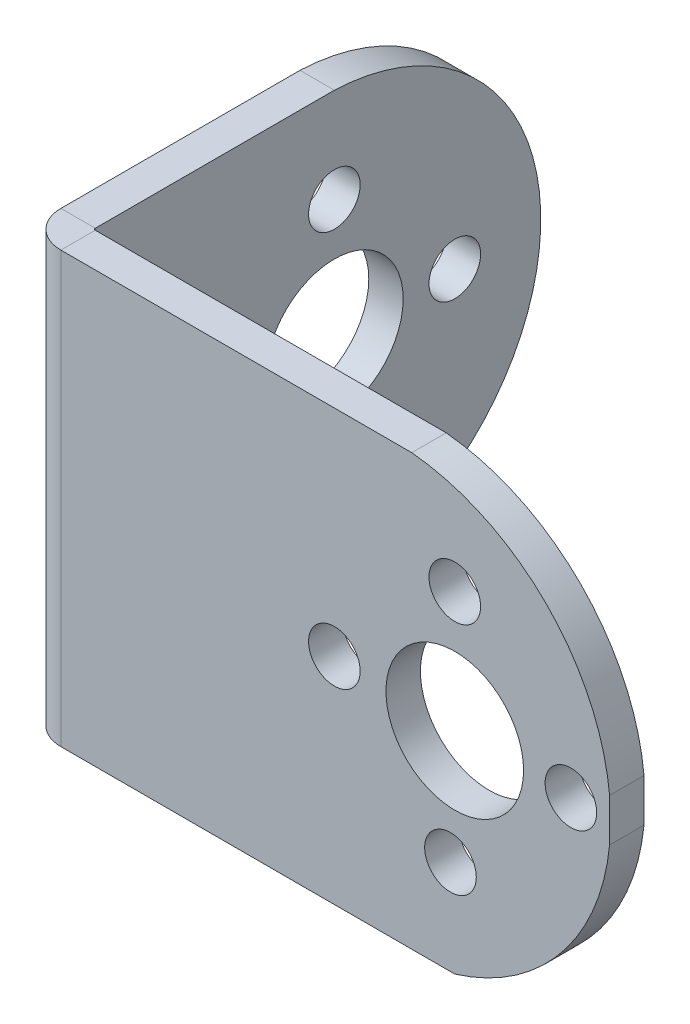
ISO-10303-21;
HEADER;
FILE_DESCRIPTION(('STEP AP214'),'2;1');
FILE_NAME('part.step','',(''),(''),'','','');
FILE_SCHEMA(('AUTOMOTIVE_DESIGN { 1 0 10303 214 1 1 1 1 }'));
ENDSEC;
DATA;
#1=APPLICATION_CONTEXT('core data for automotive mechanical design processes');
#2=APPLICATION_PROTOCOL_DEFINITION('international standard','automotive_design',2000,#1);
#3=PRODUCT_CONTEXT('',#1,'mechanical');
#4=PRODUCT('Part','Part','',(#3));
#5=PRODUCT_RELATED_PRODUCT_CATEGORY('part','',(#4));
#6=PRODUCT_DEFINITION_FORMATION('','',#4);
#7=PRODUCT_DEFINITION_CONTEXT('part definition',#1,'design');
#8=PRODUCT_DEFINITION('design','',#6,#7);
#9=PRODUCT_DEFINITION_SHAPE('','',#8);
#10=(LENGTH_UNIT() NAMED_UNIT(*) SI_UNIT(.MILLI.,.METRE.));
#11=(NAMED_UNIT(*) PLANE_ANGLE_UNIT() SI_UNIT($,.RADIAN.));
#12=(NAMED_UNIT(*) SI_UNIT($,.STERADIAN.) SOLID_ANGLE_UNIT());
#13=UNCERTAINTY_MEASURE_WITH_UNIT(LENGTH_MEASURE(1.E-05),#10,'distance_accuracy_value','');
#14=(GEOMETRIC_REPRESENTATION_CONTEXT(3) GLOBAL_UNCERTAINTY_ASSIGNED_CONTEXT((#13)) GLOBAL_UNIT_ASSIGNED_CONTEXT((#10,
#11,#12)) REPRESENTATION_CONTEXT('',''));
#15=CARTESIAN_POINT('',(0.,0.,0.));
#16=DIRECTION('',(0.,0.,1.));
#17=DIRECTION('',(1.,0.,0.));
#18=AXIS2_PLACEMENT_3D('',#15,#16,#17);
#19=CARTESIAN_POINT('',(2.00000000000001,0.,0.));
#20=DIRECTION('',(0.,1.,0.));
#21=DIRECTION('',(0.,0.,1.));
#22=AXIS2_PLACEMENT_3D('',#19,#20,#21);
#23=PLANE('',#22);
#24=DIRECTION('',(1.,0.,0.));
#25=VECTOR('',#24,1.);
#26=CARTESIAN_POINT('',(2.,0.,-2.1));
#27=LINE('',#26,#25);
#28=CARTESIAN_POINT('',(0.,0.,-2.10000000000001));
#29=VERTEX_POINT('',#28);
#30=CARTESIAN_POINT('',(2.,0.,-2.10000000000001));
#31=VERTEX_POINT('',#30);
#32=EDGE_CURVE('E12',#29,#31,#27,.T.);
#33=ORIENTED_EDGE('',*,*,#32,.F.);
#34=DIRECTION('',(0.,0.,-1.));
#35=VECTOR('',#34,1.);
#36=CARTESIAN_POINT('',(0.,0.,0.));
#37=LINE('',#36,#35);
#38=CARTESIAN_POINT('',(0.,0.,-16.));
#39=VERTEX_POINT('',#38);
#40=EDGE_CURVE('E187',#39,#29,#37,.F.);
#41=ORIENTED_EDGE('',*,*,#40,.F.);
#42=DIRECTION('',(1.,0.,0.));
#43=VECTOR('',#42,1.);
#44=CARTESIAN_POINT('',(2.,0.,-16.));
#45=LINE('',#44,#43);
#46=CARTESIAN_POINT('',(2.,0.,-16.));
#47=VERTEX_POINT('',#46);
#48=EDGE_CURVE('E100',#39,#47,#45,.T.);
#49=ORIENTED_EDGE('',*,*,#48,.T.);
#50=DIRECTION('',(0.,0.,1.));
#51=VECTOR('',#50,1.);
#52=CARTESIAN_POINT('',(2.00000000000001,0.,0.));
#53=LINE('',#52,#51);
#54=EDGE_CURVE('E208',#47,#31,#53,.T.);
#55=ORIENTED_EDGE('',*,*,#54,.T.);
#56=EDGE_LOOP('',(#33,#41,#49,#55));
#57=FACE_BOUND('',#56,.T.);
#58=ADVANCED_FACE('F71',(#57),#23,.F.);
#59=CARTESIAN_POINT('',(2.,12.5,-15.4895833333333));
#60=DIRECTION('',(1.,0.,0.));
#61=DIRECTION('',(0.,0.,-1.));
#62=AXIS2_PLACEMENT_3D('',#59,#60,#61);
#63=CYLINDRICAL_SURFACE('',#62,12.5104166666667);
#64=ORIENTED_EDGE('',*,*,#48,.F.);
#65=CARTESIAN_POINT('',(0.,12.5,-15.4895833333333));
#66=DIRECTION('',(1.,0.,0.));
#67=DIRECTION('',(0.,0.,-1.));
#68=AXIS2_PLACEMENT_3D('',#65,#66,#67);
#69=CIRCLE('',#68,12.5104166666667);
#70=CARTESIAN_POINT('',(0.,25.,-16.));
#71=VERTEX_POINT('',#70);
#72=EDGE_CURVE('E203',#71,#39,#69,.F.);
#73=ORIENTED_EDGE('',*,*,#72,.F.);
#74=DIRECTION('',(1.,0.,0.));
#75=VECTOR('',#74,1.);
#76=CARTESIAN_POINT('',(2.,25.,-16.));
#77=LINE('',#76,#75);
#78=CARTESIAN_POINT('',(2.,25.,-16.));
#79=VERTEX_POINT('',#78);
#80=EDGE_CURVE('E88',#71,#79,#77,.T.);
#81=ORIENTED_EDGE('',*,*,#80,.T.);
#82=CARTESIAN_POINT('',(2.,12.5,-15.4895833333333));
#83=DIRECTION('',(1.,0.,0.));
#84=DIRECTION('',(0.,0.,-1.));
#85=AXIS2_PLACEMENT_3D('',#82,#83,#84);
#86=CIRCLE('',#85,12.5104166666667);
#87=EDGE_CURVE('E175',#79,#47,#86,.F.);
#88=ORIENTED_EDGE('',*,*,#87,.T.);
#89=EDGE_LOOP('',(#64,#73,#81,#88));
#90=FACE_BOUND('',#89,.T.);
#91=ADVANCED_FACE('F345',(#90),#63,.T.);
#92=CARTESIAN_POINT('',(2.00000000000001,25.,0.));
#93=DIRECTION('',(0.,1.,0.));
#94=DIRECTION('',(0.,0.,1.));
#95=AXIS2_PLACEMENT_3D('',#92,#93,#94);
#96=PLANE('',#95);
#97=ORIENTED_EDGE('',*,*,#80,.F.);
#98=DIRECTION('',(0.,0.,-1.));
#99=VECTOR('',#98,1.);
#100=CARTESIAN_POINT('',(0.,25.,0.));
#101=LINE('',#100,#99);
#102=CARTESIAN_POINT('',(0.,25.,-2.10000000000001));
#103=VERTEX_POINT('',#102);
#104=EDGE_CURVE('E178',#71,#103,#101,.F.);
#105=ORIENTED_EDGE('',*,*,#104,.T.);
#106=DIRECTION('',(1.,0.,0.));
#107=VECTOR('',#106,1.);
#108=CARTESIAN_POINT('',(2.,25.,-2.1));
#109=LINE('',#108,#107);
#110=CARTESIAN_POINT('',(2.,25.,-2.1));
#111=VERTEX_POINT('',#110);
#112=EDGE_CURVE('E161',#103,#111,#109,.T.);
#113=ORIENTED_EDGE('',*,*,#112,.T.);
#114=DIRECTION('',(0.,0.,1.));
#115=VECTOR('',#114,1.);
#116=CARTESIAN_POINT('',(2.00000000000001,25.,0.));
#117=LINE('',#116,#115);
#118=EDGE_CURVE('E173',#79,#111,#117,.T.);
#119=ORIENTED_EDGE('',*,*,#118,.F.);
#120=EDGE_LOOP('',(#97,#105,#113,#119));
#121=FACE_BOUND('',#120,.T.);
#122=ADVANCED_FACE('F177',(#121),#96,.T.);
#123=CARTESIAN_POINT('',(2.,5.5,-16.));
#124=DIRECTION('',(1.,0.,0.));
#125=DIRECTION('',(0.,0.,-1.));
#126=AXIS2_PLACEMENT_3D('',#123,#124,#125);
#127=CYLINDRICAL_SURFACE('',#126,1.5);
#128=CARTESIAN_POINT('',(2.,5.5,-16.));
#129=DIRECTION('',(1.,0.,0.));
#130=DIRECTION('',(0.,0.,-1.));
#131=AXIS2_PLACEMENT_3D('',#128,#129,#130);
#132=CIRCLE('',#131,1.5);
#133=CARTESIAN_POINT('',(2.,5.5,-17.5));
#134=VERTEX_POINT('',#133);
#135=EDGE_CURVE('E205',#134,#134,#132,.T.);
#136=ORIENTED_EDGE('',*,*,#135,.T.);
#137=EDGE_LOOP('',(#136));
#138=FACE_BOUND('',#137,.T.);
#139=CARTESIAN_POINT('',(0.,5.5,-16.));
#140=DIRECTION('',(1.,0.,0.));
#141=DIRECTION('',(0.,0.,-1.));
#142=AXIS2_PLACEMENT_3D('',#139,#140,#141);
#143=CIRCLE('',#142,1.5);
#144=CARTESIAN_POINT('',(0.,5.5,-17.5));
#145=VERTEX_POINT('',#144);
#146=EDGE_CURVE('E197',#145,#145,#143,.T.);
#147=ORIENTED_EDGE('',*,*,#146,.F.);
#148=EDGE_LOOP('',(#147));
#149=FACE_BOUND('',#148,.T.);
#150=ADVANCED_FACE('F355',(#138,#149),#127,.F.);
#151=CARTESIAN_POINT('',(2.,12.5,-23.));
#152=DIRECTION('',(1.,0.,0.));
#153=DIRECTION('',(0.,0.,-1.));
#154=AXIS2_PLACEMENT_3D('',#151,#152,#153);
#155=CYLINDRICAL_SURFACE('',#154,1.5);
#156=CARTESIAN_POINT('',(2.,12.5,-23.));
#157=DIRECTION('',(1.,0.,0.));
#158=DIRECTION('',(0.,0.,-1.));
#159=AXIS2_PLACEMENT_3D('',#156,#157,#158);
#160=CIRCLE('',#159,1.5);
#161=CARTESIAN_POINT('',(2.,12.5,-24.5));
#162=VERTEX_POINT('',#161);
#163=EDGE_CURVE('E220',#162,#162,#160,.T.);
#164=ORIENTED_EDGE('',*,*,#163,.T.);
#165=EDGE_LOOP('',(#164));
#166=FACE_BOUND('',#165,.T.);
#167=CARTESIAN_POINT('',(0.,12.5,-23.));
#168=DIRECTION('',(1.,0.,0.));
#169=DIRECTION('',(0.,0.,-1.));
#170=AXIS2_PLACEMENT_3D('',#167,#168,#169);
#171=CIRCLE('',#170,1.5);
#172=CARTESIAN_POINT('',(0.,12.5,-24.5));
#173=VERTEX_POINT('',#172);
#174=EDGE_CURVE('E194',#173,#173,#171,.T.);
#175=ORIENTED_EDGE('',*,*,#174,.F.);
#176=EDGE_LOOP('',(#175));
#177=FACE_BOUND('',#176,.T.);
#178=ADVANCED_FACE('F358',(#166,#177),#155,.F.);
#179=CARTESIAN_POINT('',(2.,19.5,-16.));
#180=DIRECTION('',(1.,0.,0.));
#181=DIRECTION('',(0.,0.,-1.));
#182=AXIS2_PLACEMENT_3D('',#179,#180,#181);
#183=CYLINDRICAL_SURFACE('',#182,1.5);
#184=CARTESIAN_POINT('',(2.,19.5,-16.));
#185=DIRECTION('',(1.,0.,0.));
#186=DIRECTION('',(0.,0.,-1.));
#187=AXIS2_PLACEMENT_3D('',#184,#185,#186);
#188=CIRCLE('',#187,1.5);
#189=CARTESIAN_POINT('',(2.,19.5,-17.5));
#190=VERTEX_POINT('',#189);
#191=EDGE_CURVE('E217',#190,#190,#188,.T.);
#192=ORIENTED_EDGE('',*,*,#191,.T.);
#193=EDGE_LOOP('',(#192));
#194=FACE_BOUND('',#193,.T.);
#195=CARTESIAN_POINT('',(0.,19.5,-16.));
#196=DIRECTION('',(1.,0.,0.));
#197=DIRECTION('',(0.,0.,-1.));
#198=AXIS2_PLACEMENT_3D('',#195,#196,#197);
#199=CIRCLE('',#198,1.5);
#200=CARTESIAN_POINT('',(0.,19.5,-17.5));
#201=VERTEX_POINT('',#200);
#202=EDGE_CURVE('E191',#201,#201,#199,.T.);
#203=ORIENTED_EDGE('',*,*,#202,.F.);
#204=EDGE_LOOP('',(#203));
#205=FACE_BOUND('',#204,.T.);
#206=ADVANCED_FACE('F362',(#194,#205),#183,.F.);
#207=CARTESIAN_POINT('',(2.,12.5,-9.));
#208=DIRECTION('',(1.,0.,0.));
#209=DIRECTION('',(0.,0.,-1.));
#210=AXIS2_PLACEMENT_3D('',#207,#208,#209);
#211=CYLINDRICAL_SURFACE('',#210,1.5);
#212=CARTESIAN_POINT('',(2.,12.5,-9.));
#213=DIRECTION('',(1.,0.,0.));
#214=DIRECTION('',(0.,0.,-1.));
#215=AXIS2_PLACEMENT_3D('',#212,#213,#214);
#216=CIRCLE('',#215,1.5);
#217=CARTESIAN_POINT('',(2.,12.5,-10.5));
#218=VERTEX_POINT('',#217);
#219=EDGE_CURVE('E214',#218,#218,#216,.T.);
#220=ORIENTED_EDGE('',*,*,#219,.T.);
#221=EDGE_LOOP('',(#220));
#222=FACE_BOUND('',#221,.T.);
#223=CARTESIAN_POINT('',(0.,12.5,-9.));
#224=DIRECTION('',(1.,0.,0.));
#225=DIRECTION('',(0.,0.,-1.));
#226=AXIS2_PLACEMENT_3D('',#223,#224,#225);
#227=CIRCLE('',#226,1.5);
#228=CARTESIAN_POINT('',(0.,12.5,-10.5));
#229=VERTEX_POINT('',#228);
#230=EDGE_CURVE('E188',#229,#229,#227,.T.);
#231=ORIENTED_EDGE('',*,*,#230,.F.);
#232=EDGE_LOOP('',(#231));
#233=FACE_BOUND('',#232,.T.);
#234=ADVANCED_FACE('F365',(#222,#233),#211,.F.);
#235=CARTESIAN_POINT('',(2.,12.5,-16.));
#236=DIRECTION('',(1.,0.,0.));
#237=DIRECTION('',(0.,0.,-1.));
#238=AXIS2_PLACEMENT_3D('',#235,#236,#237);
#239=CYLINDRICAL_SURFACE('',#238,4.);
#240=CARTESIAN_POINT('',(2.,12.5,-16.));
#241=DIRECTION('',(1.,0.,0.));
#242=DIRECTION('',(0.,0.,-1.));
#243=AXIS2_PLACEMENT_3D('',#240,#241,#242);
#244=CIRCLE('',#243,4.);
#245=CARTESIAN_POINT('',(2.,12.5,-20.));
#246=VERTEX_POINT('',#245);
#247=EDGE_CURVE('E211',#246,#246,#244,.T.);
#248=ORIENTED_EDGE('',*,*,#247,.T.);
#249=EDGE_LOOP('',(#248));
#250=FACE_BOUND('',#249,.T.);
#251=CARTESIAN_POINT('',(0.,12.5,-16.));
#252=DIRECTION('',(1.,0.,0.));
#253=DIRECTION('',(0.,0.,-1.));
#254=AXIS2_PLACEMENT_3D('',#251,#252,#253);
#255=CIRCLE('',#254,4.);
#256=CARTESIAN_POINT('',(0.,12.5,-20.));
#257=VERTEX_POINT('',#256);
#258=EDGE_CURVE('E184',#257,#257,#255,.T.);
#259=ORIENTED_EDGE('',*,*,#258,.F.);
#260=EDGE_LOOP('',(#259));
#261=FACE_BOUND('',#260,.T.);
#262=ADVANCED_FACE('F73',(#250,#261),#239,.F.);
#263=CARTESIAN_POINT('',(2.00000000000001,25.,0.));
#264=DIRECTION('',(1.,0.,0.));
#265=DIRECTION('',(0.,0.,-1.));
#266=AXIS2_PLACEMENT_3D('',#263,#264,#265);
#267=PLANE('',#266);
#268=ORIENTED_EDGE('',*,*,#135,.F.);
#269=EDGE_LOOP('',(#268));
#270=FACE_BOUND('',#269,.T.);
#271=ORIENTED_EDGE('',*,*,#163,.F.);
#272=EDGE_LOOP('',(#271));
#273=FACE_BOUND('',#272,.T.);
#274=ORIENTED_EDGE('',*,*,#191,.F.);
#275=EDGE_LOOP('',(#274));
#276=FACE_BOUND('',#275,.T.);
#277=ORIENTED_EDGE('',*,*,#219,.F.);
#278=EDGE_LOOP('',(#277));
#279=FACE_BOUND('',#278,.T.);
#280=ORIENTED_EDGE('',*,*,#247,.F.);
#281=EDGE_LOOP('',(#280));
#282=FACE_BOUND('',#281,.T.);
#283=ORIENTED_EDGE('',*,*,#118,.T.);
#284=DIRECTION('',(0.,-1.,0.));
#285=VECTOR('',#284,1.);
#286=CARTESIAN_POINT('',(2.,25.,-2.1));
#287=LINE('',#286,#285);
#288=EDGE_CURVE('E154',#111,#31,#287,.T.);
#289=ORIENTED_EDGE('',*,*,#288,.T.);
#290=ORIENTED_EDGE('',*,*,#54,.F.);
#291=ORIENTED_EDGE('',*,*,#87,.F.);
#292=EDGE_LOOP('',(#283,#289,#290,#291));
#293=FACE_BOUND('',#292,.T.);
#294=ADVANCED_FACE('F174',(#270,#273,#276,#279,#282,#293),#267,.T.);
#295=CARTESIAN_POINT('',(0.,25.,0.));
#296=DIRECTION('',(1.,0.,0.));
#297=DIRECTION('',(0.,0.,-1.));
#298=AXIS2_PLACEMENT_3D('',#295,#296,#297);
#299=PLANE('',#298);
#300=ORIENTED_EDGE('',*,*,#146,.T.);
#301=EDGE_LOOP('',(#300));
#302=FACE_BOUND('',#301,.T.);
#303=ORIENTED_EDGE('',*,*,#174,.T.);
#304=EDGE_LOOP('',(#303));
#305=FACE_BOUND('',#304,.T.);
#306=ORIENTED_EDGE('',*,*,#202,.T.);
#307=EDGE_LOOP('',(#306));
#308=FACE_BOUND('',#307,.T.);
#309=ORIENTED_EDGE('',*,*,#230,.T.);
#310=EDGE_LOOP('',(#309));
#311=FACE_BOUND('',#310,.T.);
#312=ORIENTED_EDGE('',*,*,#258,.T.);
#313=EDGE_LOOP('',(#312));
#314=FACE_BOUND('',#313,.T.);
#315=ORIENTED_EDGE('',*,*,#104,.F.);
#316=ORIENTED_EDGE('',*,*,#72,.T.);
#317=ORIENTED_EDGE('',*,*,#40,.T.);
#318=DIRECTION('',(0.,-1.,0.));
#319=VECTOR('',#318,1.);
#320=CARTESIAN_POINT('',(0.,25.,-2.1));
#321=LINE('',#320,#319);
#322=EDGE_CURVE('E80',#103,#29,#321,.T.);
#323=ORIENTED_EDGE('',*,*,#322,.F.);
#324=EDGE_LOOP('',(#315,#316,#317,#323));
#325=FACE_BOUND('',#324,.T.);
#326=ADVANCED_FACE('F377',(#302,#305,#308,#311,#314,#325),#299,.F.);
#327=CARTESIAN_POINT('',(21.25,12.25,-2.00000000000001));
#328=DIRECTION('',(0.,0.,1.));
#329=DIRECTION('',(1.,0.,0.));
#330=AXIS2_PLACEMENT_3D('',#327,#328,#329);
#331=CYLINDRICAL_SURFACE('',#330,12.811127975319);
#332=DIRECTION('',(0.,0.,-1.));
#333=VECTOR('',#332,1.);
#334=CARTESIAN_POINT('',(34.,11.,-2.00000000000001));
#335=LINE('',#334,#333);
#336=CARTESIAN_POINT('',(34.,11.,0.));
#337=VERTEX_POINT('',#336);
#338=CARTESIAN_POINT('',(34.,11.,-2.00000000000001));
#339=VERTEX_POINT('',#338);
#340=EDGE_CURVE('E236',#337,#339,#335,.T.);
#341=ORIENTED_EDGE('',*,*,#340,.F.);
#342=CARTESIAN_POINT('',(21.25,12.25,0.));
#343=DIRECTION('',(0.,0.,1.));
#344=DIRECTION('',(1.,0.,0.));
#345=AXIS2_PLACEMENT_3D('',#342,#343,#344);
#346=CIRCLE('',#345,12.811127975319);
#347=CARTESIAN_POINT('',(25.,0.,0.));
#348=VERTEX_POINT('',#347);
#349=EDGE_CURVE('E285',#348,#337,#346,.T.);
#350=ORIENTED_EDGE('',*,*,#349,.F.);
#351=DIRECTION('',(0.,0.,-1.));
#352=VECTOR('',#351,1.);
#353=CARTESIAN_POINT('',(25.,0.,-2.));
#354=LINE('',#353,#352);
#355=CARTESIAN_POINT('',(25.,0.,-2.));
#356=VERTEX_POINT('',#355);
#357=EDGE_CURVE('E228',#348,#356,#354,.T.);
#358=ORIENTED_EDGE('',*,*,#357,.T.);
#359=CARTESIAN_POINT('',(21.25,12.25,-2.00000000000001));
#360=DIRECTION('',(0.,0.,1.));
#361=DIRECTION('',(1.,0.,0.));
#362=AXIS2_PLACEMENT_3D('',#359,#360,#361);
#363=CIRCLE('',#362,12.811127975319);
#364=EDGE_CURVE('E230',#356,#339,#363,.T.);
#365=ORIENTED_EDGE('',*,*,#364,.T.);
#366=EDGE_LOOP('',(#341,#350,#358,#365));
#367=FACE_BOUND('',#366,.T.);
#368=ADVANCED_FACE('F319',(#367),#331,.T.);
#369=CARTESIAN_POINT('',(34.,25.,-2.));
#370=DIRECTION('',(-1.,0.,0.));
#371=DIRECTION('',(0.,-1.,0.));
#372=AXIS2_PLACEMENT_3D('',#369,#370,#371);
#373=PLANE('',#372);
#374=DIRECTION('',(0.,0.,-1.));
#375=VECTOR('',#374,1.);
#376=CARTESIAN_POINT('',(34.,13.5,-2.));
#377=LINE('',#376,#375);
#378=CARTESIAN_POINT('',(34.,13.5,0.));
#379=VERTEX_POINT('',#378);
#380=CARTESIAN_POINT('',(34.,13.5,-2.));
#381=VERTEX_POINT('',#380);
#382=EDGE_CURVE('E238',#379,#381,#377,.T.);
#383=ORIENTED_EDGE('',*,*,#382,.F.);
#384=DIRECTION('',(0.,1.,0.));
#385=VECTOR('',#384,1.);
#386=CARTESIAN_POINT('',(34.,25.,0.));
#387=LINE('',#386,#385);
#388=EDGE_CURVE('E233',#379,#337,#387,.F.);
#389=ORIENTED_EDGE('',*,*,#388,.T.);
#390=ORIENTED_EDGE('',*,*,#340,.T.);
#391=DIRECTION('',(0.,-1.,0.));
#392=VECTOR('',#391,1.);
#393=CARTESIAN_POINT('',(34.,25.,-2.));
#394=LINE('',#393,#392);
#395=EDGE_CURVE('E278',#381,#339,#394,.T.);
#396=ORIENTED_EDGE('',*,*,#395,.F.);
#397=EDGE_LOOP('',(#383,#389,#390,#396));
#398=FACE_BOUND('',#397,.T.);
#399=ADVANCED_FACE('F326',(#398),#373,.F.);
#400=CARTESIAN_POINT('',(21.25,12.25,-2.00000000000001));
#401=DIRECTION('',(0.,0.,1.));
#402=DIRECTION('',(1.,0.,0.));
#403=AXIS2_PLACEMENT_3D('',#400,#401,#402);
#404=CYLINDRICAL_SURFACE('',#403,12.811127975319);
#405=DIRECTION('',(0.,0.,-1.));
#406=VECTOR('',#405,1.);
#407=CARTESIAN_POINT('',(22.5,25.,-2.00000000000001));
#408=LINE('',#407,#406);
#409=CARTESIAN_POINT('',(22.5,25.,0.));
#410=VERTEX_POINT('',#409);
#411=CARTESIAN_POINT('',(22.5,25.,-2.00000000000001));
#412=VERTEX_POINT('',#411);
#413=EDGE_CURVE('E281',#410,#412,#408,.T.);
#414=ORIENTED_EDGE('',*,*,#413,.F.);
#415=CARTESIAN_POINT('',(21.25,12.25,0.));
#416=DIRECTION('',(0.,0.,1.));
#417=DIRECTION('',(1.,0.,0.));
#418=AXIS2_PLACEMENT_3D('',#415,#416,#417);
#419=CIRCLE('',#418,12.811127975319);
#420=EDGE_CURVE('E288',#379,#410,#419,.T.);
#421=ORIENTED_EDGE('',*,*,#420,.F.);
#422=ORIENTED_EDGE('',*,*,#382,.T.);
#423=CARTESIAN_POINT('',(21.25,12.25,-2.00000000000001));
#424=DIRECTION('',(0.,0.,1.));
#425=DIRECTION('',(1.,0.,0.));
#426=AXIS2_PLACEMENT_3D('',#423,#424,#425);
#427=CIRCLE('',#426,12.811127975319);
#428=EDGE_CURVE('E240',#381,#412,#427,.T.);
#429=ORIENTED_EDGE('',*,*,#428,.T.);
#430=EDGE_LOOP('',(#414,#421,#422,#429));
#431=FACE_BOUND('',#430,.T.);
#432=ADVANCED_FACE('F330',(#431),#404,.T.);
#433=CARTESIAN_POINT('',(25.,12.25,-2.00000000000001));
#434=DIRECTION('',(0.,0.,1.));
#435=DIRECTION('',(1.,0.,0.));
#436=AXIS2_PLACEMENT_3D('',#433,#434,#435);
#437=CYLINDRICAL_SURFACE('',#436,4.);
#438=CARTESIAN_POINT('',(25.,12.25,-2.00000000000001));
#439=DIRECTION('',(0.,0.,1.));
#440=DIRECTION('',(1.,0.,0.));
#441=AXIS2_PLACEMENT_3D('',#438,#439,#440);
#442=CIRCLE('',#441,4.);
#443=CARTESIAN_POINT('',(29.,12.25,-2.00000000000001));
#444=VERTEX_POINT('',#443);
#445=EDGE_CURVE('E270',#444,#444,#442,.T.);
#446=ORIENTED_EDGE('',*,*,#445,.F.);
#447=EDGE_LOOP('',(#446));
#448=FACE_BOUND('',#447,.T.);
#449=CARTESIAN_POINT('',(25.,12.25,0.));
#450=DIRECTION('',(0.,0.,1.));
#451=DIRECTION('',(1.,0.,0.));
#452=AXIS2_PLACEMENT_3D('',#449,#450,#451);
#453=CIRCLE('',#452,4.);
#454=CARTESIAN_POINT('',(29.,12.25,0.));
#455=VERTEX_POINT('',#454);
#456=EDGE_CURVE('E243',#455,#455,#453,.T.);
#457=ORIENTED_EDGE('',*,*,#456,.T.);
#458=EDGE_LOOP('',(#457));
#459=FACE_BOUND('',#458,.T.);
#460=ADVANCED_FACE('F462',(#448,#459),#437,.F.);
#461=CARTESIAN_POINT('',(18.0000000000001,12.5,-2.00000000000001));
#462=DIRECTION('',(0.,0.,1.));
#463=DIRECTION('',(1.,0.,0.));
#464=AXIS2_PLACEMENT_3D('',#461,#462,#463);
#465=CYLINDRICAL_SURFACE('',#464,1.5);
#466=CARTESIAN_POINT('',(18.0000000000001,12.5,-2.00000000000001));
#467=DIRECTION('',(0.,0.,1.));
#468=DIRECTION('',(1.,0.,0.));
#469=AXIS2_PLACEMENT_3D('',#466,#467,#468);
#470=CIRCLE('',#469,1.5);
#471=CARTESIAN_POINT('',(19.5000000000001,12.5,-2.00000000000001));
#472=VERTEX_POINT('',#471);
#473=EDGE_CURVE('E267',#472,#472,#470,.T.);
#474=ORIENTED_EDGE('',*,*,#473,.F.);
#475=EDGE_LOOP('',(#474));
#476=FACE_BOUND('',#475,.T.);
#477=CARTESIAN_POINT('',(18.0000000000001,12.5,0.));
#478=DIRECTION('',(0.,0.,1.));
#479=DIRECTION('',(1.,0.,0.));
#480=AXIS2_PLACEMENT_3D('',#477,#478,#479);
#481=CIRCLE('',#480,1.5);
#482=CARTESIAN_POINT('',(19.5000000000001,12.5,0.));
#483=VERTEX_POINT('',#482);
#484=EDGE_CURVE('E246',#483,#483,#481,.T.);
#485=ORIENTED_EDGE('',*,*,#484,.T.);
#486=EDGE_LOOP('',(#485));
#487=FACE_BOUND('',#486,.T.);
#488=ADVANCED_FACE('F472',(#476,#487),#465,.F.);
#489=CARTESIAN_POINT('',(24.7500000000001,5.50000000000007,-2.00000000000001));
#490=DIRECTION('',(0.,0.,1.));
#491=DIRECTION('',(1.,0.,0.));
#492=AXIS2_PLACEMENT_3D('',#489,#490,#491);
#493=CYLINDRICAL_SURFACE('',#492,1.5);
#494=CARTESIAN_POINT('',(24.7500000000001,5.50000000000007,-2.00000000000001));
#495=DIRECTION('',(0.,0.,1.));
#496=DIRECTION('',(1.,0.,0.));
#497=AXIS2_PLACEMENT_3D('',#494,#495,#496);
#498=CIRCLE('',#497,1.5);
#499=CARTESIAN_POINT('',(26.2500000000001,5.50000000000007,-2.00000000000001));
#500=VERTEX_POINT('',#499);
#501=EDGE_CURVE('E264',#500,#500,#498,.T.);
#502=ORIENTED_EDGE('',*,*,#501,.F.);
#503=EDGE_LOOP('',(#502));
#504=FACE_BOUND('',#503,.T.);
#505=CARTESIAN_POINT('',(24.7500000000001,5.50000000000007,0.));
#506=DIRECTION('',(0.,0.,1.));
#507=DIRECTION('',(1.,0.,0.));
#508=AXIS2_PLACEMENT_3D('',#505,#506,#507);
#509=CIRCLE('',#508,1.5);
#510=CARTESIAN_POINT('',(26.2500000000001,5.50000000000007,0.));
#511=VERTEX_POINT('',#510);
#512=EDGE_CURVE('E249',#511,#511,#509,.T.);
#513=ORIENTED_EDGE('',*,*,#512,.T.);
#514=EDGE_LOOP('',(#513));
#515=FACE_BOUND('',#514,.T.);
#516=ADVANCED_FACE('F483',(#504,#515),#493,.F.);
#517=CARTESIAN_POINT('',(31.75,12.2500000000001,-2.00000000000001));
#518=DIRECTION('',(0.,0.,1.));
#519=DIRECTION('',(1.,0.,0.));
#520=AXIS2_PLACEMENT_3D('',#517,#518,#519);
#521=CYLINDRICAL_SURFACE('',#520,1.5);
#522=CARTESIAN_POINT('',(31.75,12.2500000000001,-2.00000000000001));
#523=DIRECTION('',(0.,0.,1.));
#524=DIRECTION('',(1.,0.,0.));
#525=AXIS2_PLACEMENT_3D('',#522,#523,#524);
#526=CIRCLE('',#525,1.5);
#527=CARTESIAN_POINT('',(33.25,12.2500000000001,-2.00000000000001));
#528=VERTEX_POINT('',#527);
#529=EDGE_CURVE('E261',#528,#528,#526,.T.);
#530=ORIENTED_EDGE('',*,*,#529,.F.);
#531=EDGE_LOOP('',(#530));
#532=FACE_BOUND('',#531,.T.);
#533=CARTESIAN_POINT('',(31.75,12.2500000000001,0.));
#534=DIRECTION('',(0.,0.,1.));
#535=DIRECTION('',(1.,0.,0.));
#536=AXIS2_PLACEMENT_3D('',#533,#534,#535);
#537=CIRCLE('',#536,1.5);
#538=CARTESIAN_POINT('',(33.25,12.2500000000001,0.));
#539=VERTEX_POINT('',#538);
#540=EDGE_CURVE('E252',#539,#539,#537,.T.);
#541=ORIENTED_EDGE('',*,*,#540,.T.);
#542=EDGE_LOOP('',(#541));
#543=FACE_BOUND('',#542,.T.);
#544=ADVANCED_FACE('F494',(#532,#543),#521,.F.);
#545=CARTESIAN_POINT('',(25.,19.25,-2.00000000000001));
#546=DIRECTION('',(0.,0.,1.));
#547=DIRECTION('',(1.,0.,0.));
#548=AXIS2_PLACEMENT_3D('',#545,#546,#547);
#549=CYLINDRICAL_SURFACE('',#548,1.5);
#550=CARTESIAN_POINT('',(25.,19.25,-2.00000000000001));
#551=DIRECTION('',(0.,0.,1.));
#552=DIRECTION('',(1.,0.,0.));
#553=AXIS2_PLACEMENT_3D('',#550,#551,#552);
#554=CIRCLE('',#553,1.5);
#555=CARTESIAN_POINT('',(26.5,19.25,-2.00000000000001));
#556=VERTEX_POINT('',#555);
#557=EDGE_CURVE('E258',#556,#556,#554,.T.);
#558=ORIENTED_EDGE('',*,*,#557,.F.);
#559=EDGE_LOOP('',(#558));
#560=FACE_BOUND('',#559,.T.);
#561=CARTESIAN_POINT('',(25.,19.25,0.));
#562=DIRECTION('',(0.,0.,1.));
#563=DIRECTION('',(1.,0.,0.));
#564=AXIS2_PLACEMENT_3D('',#561,#562,#563);
#565=CIRCLE('',#564,1.5);
#566=CARTESIAN_POINT('',(26.5,19.25,0.));
#567=VERTEX_POINT('',#566);
#568=EDGE_CURVE('E255',#567,#567,#565,.T.);
#569=ORIENTED_EDGE('',*,*,#568,.T.);
#570=EDGE_LOOP('',(#569));
#571=FACE_BOUND('',#570,.T.);
#572=ADVANCED_FACE('F341',(#560,#571),#549,.F.);
#573=CARTESIAN_POINT('',(34.,25.,-2.));
#574=DIRECTION('',(0.,0.,1.));
#575=DIRECTION('',(1.,0.,0.));
#576=AXIS2_PLACEMENT_3D('',#573,#574,#575);
#577=PLANE('',#576);
#578=ORIENTED_EDGE('',*,*,#557,.T.);
#579=EDGE_LOOP('',(#578));
#580=FACE_BOUND('',#579,.T.);
#581=ORIENTED_EDGE('',*,*,#529,.T.);
#582=EDGE_LOOP('',(#581));
#583=FACE_BOUND('',#582,.T.);
#584=ORIENTED_EDGE('',*,*,#501,.T.);
#585=EDGE_LOOP('',(#584));
#586=FACE_BOUND('',#585,.T.);
#587=ORIENTED_EDGE('',*,*,#473,.T.);
#588=EDGE_LOOP('',(#587));
#589=FACE_BOUND('',#588,.T.);
#590=ORIENTED_EDGE('',*,*,#445,.T.);
#591=EDGE_LOOP('',(#590));
#592=FACE_BOUND('',#591,.T.);
#593=DIRECTION('',(-1.,0.,0.));
#594=VECTOR('',#593,1.);
#595=CARTESIAN_POINT('',(34.,0.,-2.));
#596=LINE('',#595,#594);
#597=CARTESIAN_POINT('',(2.1,0.,-2.));
#598=VERTEX_POINT('',#597);
#599=EDGE_CURVE('E273',#356,#598,#596,.T.);
#600=ORIENTED_EDGE('',*,*,#599,.T.);
#601=DIRECTION('',(0.,1.,0.));
#602=VECTOR('',#601,1.);
#603=CARTESIAN_POINT('',(2.1,25.,-2.));
#604=LINE('',#603,#602);
#605=CARTESIAN_POINT('',(2.1,25.,-2.));
#606=VERTEX_POINT('',#605);
#607=EDGE_CURVE('E275',#598,#606,#604,.T.);
#608=ORIENTED_EDGE('',*,*,#607,.T.);
#609=DIRECTION('',(-1.,0.,0.));
#610=VECTOR('',#609,1.);
#611=CARTESIAN_POINT('',(34.,25.,-2.));
#612=LINE('',#611,#610);
#613=EDGE_CURVE('E283',#412,#606,#612,.T.);
#614=ORIENTED_EDGE('',*,*,#613,.F.);
#615=ORIENTED_EDGE('',*,*,#428,.F.);
#616=ORIENTED_EDGE('',*,*,#395,.T.);
#617=ORIENTED_EDGE('',*,*,#364,.F.);
#618=EDGE_LOOP('',(#600,#608,#614,#615,#616,#617));
#619=FACE_BOUND('',#618,.T.);
#620=ADVANCED_FACE('F321',(#580,#583,#586,#589,#592,#619),#577,.F.);
#621=CARTESIAN_POINT('',(34.,25.,-2.));
#622=DIRECTION('',(0.,1.,0.));
#623=DIRECTION('',(-1.,0.,0.));
#624=AXIS2_PLACEMENT_3D('',#621,#622,#623);
#625=PLANE('',#624);
#626=DIRECTION('',(0.,0.,-1.));
#627=VECTOR('',#626,1.);
#628=CARTESIAN_POINT('',(2.1,25.,-2.));
#629=LINE('',#628,#627);
#630=CARTESIAN_POINT('',(2.10000000000005,25.,0.));
#631=VERTEX_POINT('',#630);
#632=EDGE_CURVE('E170',#631,#606,#629,.T.);
#633=ORIENTED_EDGE('',*,*,#632,.F.);
#634=DIRECTION('',(1.,0.,0.));
#635=VECTOR('',#634,1.);
#636=CARTESIAN_POINT('',(34.,25.,0.));
#637=LINE('',#636,#635);
#638=EDGE_CURVE('E291',#410,#631,#637,.F.);
#639=ORIENTED_EDGE('',*,*,#638,.F.);
#640=ORIENTED_EDGE('',*,*,#413,.T.);
#641=ORIENTED_EDGE('',*,*,#613,.T.);
#642=EDGE_LOOP('',(#633,#639,#640,#641));
#643=FACE_BOUND('',#642,.T.);
#644=ADVANCED_FACE('F332',(#643),#625,.T.);
#645=CARTESIAN_POINT('',(34.,25.,0.));
#646=DIRECTION('',(0.,0.,1.));
#647=DIRECTION('',(1.,0.,0.));
#648=AXIS2_PLACEMENT_3D('',#645,#646,#647);
#649=PLANE('',#648);
#650=ORIENTED_EDGE('',*,*,#568,.F.);
#651=EDGE_LOOP('',(#650));
#652=FACE_BOUND('',#651,.T.);
#653=ORIENTED_EDGE('',*,*,#540,.F.);
#654=EDGE_LOOP('',(#653));
#655=FACE_BOUND('',#654,.T.);
#656=ORIENTED_EDGE('',*,*,#512,.F.);
#657=EDGE_LOOP('',(#656));
#658=FACE_BOUND('',#657,.T.);
#659=ORIENTED_EDGE('',*,*,#484,.F.);
#660=EDGE_LOOP('',(#659));
#661=FACE_BOUND('',#660,.T.);
#662=ORIENTED_EDGE('',*,*,#456,.F.);
#663=EDGE_LOOP('',(#662));
#664=FACE_BOUND('',#663,.T.);
#665=DIRECTION('',(1.,0.,0.));
#666=VECTOR('',#665,1.);
#667=CARTESIAN_POINT('',(34.,0.,0.));
#668=LINE('',#667,#666);
#669=CARTESIAN_POINT('',(2.1,0.,0.));
#670=VERTEX_POINT('',#669);
#671=EDGE_CURVE('E293',#348,#670,#668,.F.);
#672=ORIENTED_EDGE('',*,*,#671,.F.);
#673=ORIENTED_EDGE('',*,*,#349,.T.);
#674=ORIENTED_EDGE('',*,*,#388,.F.);
#675=ORIENTED_EDGE('',*,*,#420,.T.);
#676=ORIENTED_EDGE('',*,*,#638,.T.);
#677=DIRECTION('',(0.,1.,0.));
#678=VECTOR('',#677,1.);
#679=CARTESIAN_POINT('',(2.1,25.,0.));
#680=LINE('',#679,#678);
#681=EDGE_CURVE('E171',#670,#631,#680,.T.);
#682=ORIENTED_EDGE('',*,*,#681,.F.);
#683=EDGE_LOOP('',(#672,#673,#674,#675,#676,#682));
#684=FACE_BOUND('',#683,.T.);
#685=ADVANCED_FACE('F309',(#652,#655,#658,#661,#664,#684),#649,.T.);
#686=CARTESIAN_POINT('',(34.,0.,-2.));
#687=DIRECTION('',(0.,1.,0.));
#688=DIRECTION('',(-1.,0.,0.));
#689=AXIS2_PLACEMENT_3D('',#686,#687,#688);
#690=PLANE('',#689);
#691=ORIENTED_EDGE('',*,*,#357,.F.);
#692=ORIENTED_EDGE('',*,*,#671,.T.);
#693=DIRECTION('',(0.,0.,-1.));
#694=VECTOR('',#693,1.);
#695=CARTESIAN_POINT('',(2.1,0.,-2.));
#696=LINE('',#695,#694);
#697=EDGE_CURVE('E200',#670,#598,#696,.T.);
#698=ORIENTED_EDGE('',*,*,#697,.T.);
#699=ORIENTED_EDGE('',*,*,#599,.F.);
#700=EDGE_LOOP('',(#691,#692,#698,#699));
#701=FACE_BOUND('',#700,.T.);
#702=ADVANCED_FACE('F316',(#701),#690,.F.);
#703=CARTESIAN_POINT('',(2.1,0.,-2.1));
#704=DIRECTION('',(0.,1.,0.));
#705=DIRECTION('',(0.,0.,1.));
#706=AXIS2_PLACEMENT_3D('',#703,#704,#705);
#707=PLANE('',#706);
#708=ORIENTED_EDGE('',*,*,#697,.F.);
#709=CARTESIAN_POINT('',(2.1,0.,-2.1));
#710=DIRECTION('',(0.,1.,0.));
#711=DIRECTION('',(0.,0.,1.));
#712=AXIS2_PLACEMENT_3D('',#709,#710,#711);
#713=CIRCLE('',#712,2.1);
#714=EDGE_CURVE('E297',#670,#29,#713,.F.);
#715=ORIENTED_EDGE('',*,*,#714,.T.);
#716=ORIENTED_EDGE('',*,*,#32,.T.);
#717=CARTESIAN_POINT('',(2.1,0.,-2.1));
#718=DIRECTION('',(0.,-1.,0.));
#719=DIRECTION('',(0.,0.,-1.));
#720=AXIS2_PLACEMENT_3D('',#717,#718,#719);
#721=CIRCLE('',#720,0.0999999999999998);
#722=EDGE_CURVE('E108',#598,#31,#721,.T.);
#723=ORIENTED_EDGE('',*,*,#722,.F.);
#724=EDGE_LOOP('',(#708,#715,#716,#723));
#725=FACE_BOUND('',#724,.T.);
#726=ADVANCED_FACE('F313',(#725),#707,.F.);
#727=CARTESIAN_POINT('',(2.1,25.,-2.1));
#728=DIRECTION('',(0.,-1.,0.));
#729=DIRECTION('',(0.,0.,-1.));
#730=AXIS2_PLACEMENT_3D('',#727,#728,#729);
#731=PLANE('',#730);
#732=ORIENTED_EDGE('',*,*,#112,.F.);
#733=CARTESIAN_POINT('',(2.1,25.,-2.1));
#734=DIRECTION('',(0.,1.,0.));
#735=DIRECTION('',(0.,0.,1.));
#736=AXIS2_PLACEMENT_3D('',#733,#734,#735);
#737=CIRCLE('',#736,2.1);
#738=EDGE_CURVE('E300',#103,#631,#737,.T.);
#739=ORIENTED_EDGE('',*,*,#738,.T.);
#740=ORIENTED_EDGE('',*,*,#632,.T.);
#741=CARTESIAN_POINT('',(2.1,25.,-2.1));
#742=DIRECTION('',(0.,1.,0.));
#743=DIRECTION('',(0.,0.,1.));
#744=AXIS2_PLACEMENT_3D('',#741,#742,#743);
#745=CIRCLE('',#744,0.0999999999999998);
#746=EDGE_CURVE('E157',#111,#606,#745,.T.);
#747=ORIENTED_EDGE('',*,*,#746,.F.);
#748=EDGE_LOOP('',(#732,#739,#740,#747));
#749=FACE_BOUND('',#748,.T.);
#750=ADVANCED_FACE('F165',(#749),#731,.F.);
#751=CARTESIAN_POINT('',(2.1,-12.6393228892771,-2.1));
#752=DIRECTION('',(0.,1.,0.));
#753=DIRECTION('',(0.,0.,1.));
#754=AXIS2_PLACEMENT_3D('',#751,#752,#753);
#755=CYLINDRICAL_SURFACE('',#754,0.1);
#756=ORIENTED_EDGE('',*,*,#746,.T.);
#757=ORIENTED_EDGE('',*,*,#607,.F.);
#758=ORIENTED_EDGE('',*,*,#722,.T.);
#759=ORIENTED_EDGE('',*,*,#288,.F.);
#760=EDGE_LOOP('',(#756,#757,#758,#759));
#761=FACE_BOUND('',#760,.T.);
#762=ADVANCED_FACE('F156',(#761),#755,.F.);
#763=CARTESIAN_POINT('',(2.1,-12.6393228892771,-2.1));
#764=DIRECTION('',(0.,1.,0.));
#765=DIRECTION('',(0.,0.,1.));
#766=AXIS2_PLACEMENT_3D('',#763,#764,#765);
#767=CYLINDRICAL_SURFACE('',#766,2.1);
#768=ORIENTED_EDGE('',*,*,#738,.F.);
#769=ORIENTED_EDGE('',*,*,#322,.T.);
#770=ORIENTED_EDGE('',*,*,#714,.F.);
#771=ORIENTED_EDGE('',*,*,#681,.T.);
#772=EDGE_LOOP('',(#768,#769,#770,#771));
#773=FACE_BOUND('',#772,.T.);
#774=ADVANCED_FACE('F305',(#773),#767,.T.);
#775=CLOSED_SHELL('',(#58,#91,#122,#150,#178,#206,#234,#262,#294,#326,#368,#399,#432,#460,#488,
#516,#544,#572,#620,#644,#685,#702,#726,#750,#762,#774));
#776=MANIFOLD_SOLID_BREP('B2',#775);
#777=ADVANCED_BREP_SHAPE_REPRESENTATION('',(#18,#776),#14);
#778=SHAPE_DEFINITION_REPRESENTATION(#9,#777);
ENDSEC;
END-ISO-10303-21;
